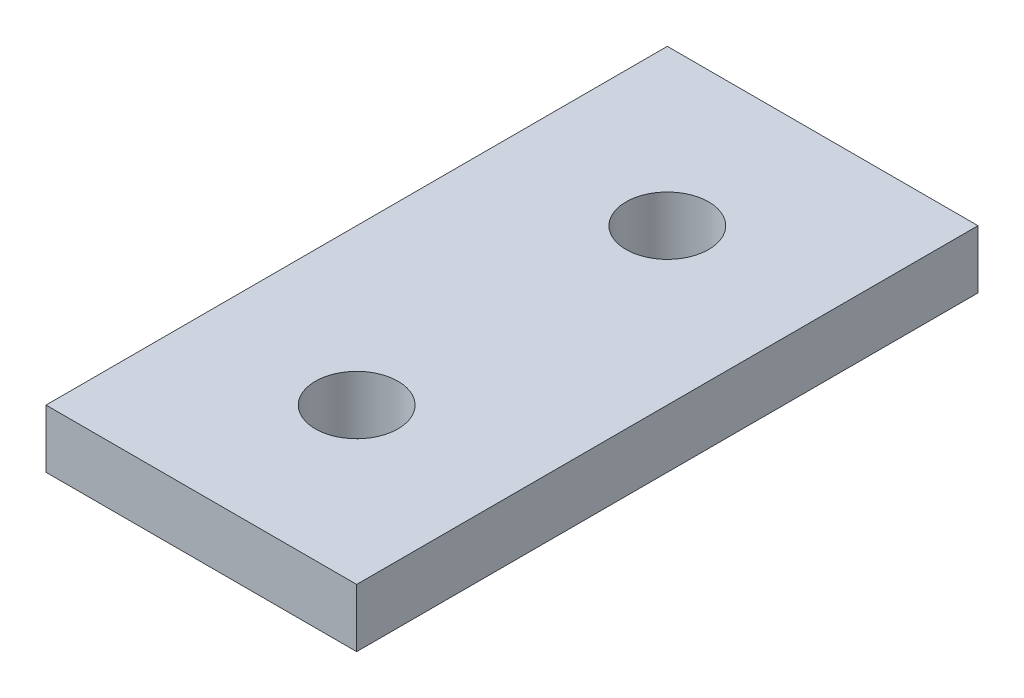
ISO-10303-21;
HEADER;
FILE_DESCRIPTION(('STEP AP214'),'2;1');
FILE_NAME('part.step','',(''),(''),'','','');
FILE_SCHEMA(('AUTOMOTIVE_DESIGN { 1 0 10303 214 1 1 1 1 }'));
ENDSEC;
DATA;
#1=APPLICATION_CONTEXT('core data for automotive mechanical design processes');
#2=APPLICATION_PROTOCOL_DEFINITION('international standard','automotive_design',2000,#1);
#3=PRODUCT_CONTEXT('',#1,'mechanical');
#4=PRODUCT('Part','Part','',(#3));
#5=PRODUCT_RELATED_PRODUCT_CATEGORY('part','',(#4));
#6=PRODUCT_DEFINITION_FORMATION('','',#4);
#7=PRODUCT_DEFINITION_CONTEXT('part definition',#1,'design');
#8=PRODUCT_DEFINITION('design','',#6,#7);
#9=PRODUCT_DEFINITION_SHAPE('','',#8);
#10=(LENGTH_UNIT() NAMED_UNIT(*) SI_UNIT(.MILLI.,.METRE.));
#11=(NAMED_UNIT(*) PLANE_ANGLE_UNIT() SI_UNIT($,.RADIAN.));
#12=(NAMED_UNIT(*) SI_UNIT($,.STERADIAN.) SOLID_ANGLE_UNIT());
#13=UNCERTAINTY_MEASURE_WITH_UNIT(LENGTH_MEASURE(1.E-05),#10,'distance_accuracy_value','');
#14=(GEOMETRIC_REPRESENTATION_CONTEXT(3) GLOBAL_UNCERTAINTY_ASSIGNED_CONTEXT((#13)) GLOBAL_UNIT_ASSIGNED_CONTEXT((#10,
#11,#12)) REPRESENTATION_CONTEXT('',''));
#15=CARTESIAN_POINT('',(0.,0.,0.));
#16=DIRECTION('',(0.,0.,1.));
#17=DIRECTION('',(1.,0.,0.));
#18=AXIS2_PLACEMENT_3D('',#15,#16,#17);
#19=CARTESIAN_POINT('',(0.,4.7625,0.));
#20=DIRECTION('',(0.,-1.,0.));
#21=DIRECTION('',(0.,0.,-1.));
#22=AXIS2_PLACEMENT_3D('',#19,#20,#21);
#23=PLANE('',#22);
#24=CARTESIAN_POINT('',(12.7,4.7625,-38.1));
#25=DIRECTION('',(0.,1.,0.));
#26=DIRECTION('',(0.,0.,1.));
#27=AXIS2_PLACEMENT_3D('',#24,#25,#26);
#28=CIRCLE('',#27,3.3782);
#29=CARTESIAN_POINT('',(12.7,4.7625,-41.4782));
#30=VERTEX_POINT('',#29);
#31=EDGE_CURVE('E101',#30,#30,#28,.T.);
#32=ORIENTED_EDGE('',*,*,#31,.F.);
#33=EDGE_LOOP('',(#32));
#34=FACE_BOUND('',#33,.T.);
#35=DIRECTION('',(0.,0.,1.));
#36=VECTOR('',#35,1.);
#37=CARTESIAN_POINT('',(0.,4.7625,0.));
#38=LINE('',#37,#36);
#39=CARTESIAN_POINT('',(0.,4.7625,-50.8));
#40=VERTEX_POINT('',#39);
#41=CARTESIAN_POINT('',(0.,4.7625,0.));
#42=VERTEX_POINT('',#41);
#43=EDGE_CURVE('E86',#40,#42,#38,.T.);
#44=ORIENTED_EDGE('',*,*,#43,.T.);
#45=DIRECTION('',(1.,0.,0.));
#46=VECTOR('',#45,1.);
#47=CARTESIAN_POINT('',(0.,4.7625,0.));
#48=LINE('',#47,#46);
#49=CARTESIAN_POINT('',(25.4,4.7625,0.));
#50=VERTEX_POINT('',#49);
#51=EDGE_CURVE('E81',#42,#50,#48,.T.);
#52=ORIENTED_EDGE('',*,*,#51,.T.);
#53=DIRECTION('',(0.,0.,-1.));
#54=VECTOR('',#53,1.);
#55=CARTESIAN_POINT('',(25.4,4.7625,0.));
#56=LINE('',#55,#54);
#57=CARTESIAN_POINT('',(25.4,4.7625,-50.8));
#58=VERTEX_POINT('',#57);
#59=EDGE_CURVE('E84',#50,#58,#56,.T.);
#60=ORIENTED_EDGE('',*,*,#59,.T.);
#61=DIRECTION('',(-1.,0.,0.));
#62=VECTOR('',#61,1.);
#63=CARTESIAN_POINT('',(0.,4.7625,-50.8));
#64=LINE('',#63,#62);
#65=EDGE_CURVE('E51',#58,#40,#64,.T.);
#66=ORIENTED_EDGE('',*,*,#65,.T.);
#67=EDGE_LOOP('',(#44,#52,#60,#66));
#68=FACE_BOUND('',#67,.T.);
#69=CARTESIAN_POINT('',(12.7,4.7625,-12.7));
#70=DIRECTION('',(0.,1.,0.));
#71=DIRECTION('',(0.,0.,1.));
#72=AXIS2_PLACEMENT_3D('',#69,#70,#71);
#73=CIRCLE('',#72,3.3782);
#74=CARTESIAN_POINT('',(12.7,4.7625,-16.0782));
#75=VERTEX_POINT('',#74);
#76=EDGE_CURVE('E116',#75,#75,#73,.T.);
#77=ORIENTED_EDGE('',*,*,#76,.F.);
#78=EDGE_LOOP('',(#77));
#79=FACE_BOUND('',#78,.T.);
#80=ADVANCED_FACE('F34',(#34,#68,#79),#23,.F.);
#81=CARTESIAN_POINT('',(0.,0.,0.));
#82=DIRECTION('',(0.,-1.,0.));
#83=DIRECTION('',(0.,0.,-1.));
#84=AXIS2_PLACEMENT_3D('',#81,#82,#83);
#85=PLANE('',#84);
#86=CARTESIAN_POINT('',(12.7,0.,-38.1));
#87=DIRECTION('',(0.,1.,0.));
#88=DIRECTION('',(0.,0.,1.));
#89=AXIS2_PLACEMENT_3D('',#86,#87,#88);
#90=CIRCLE('',#89,3.3782);
#91=CARTESIAN_POINT('',(12.7,0.,-41.4782));
#92=VERTEX_POINT('',#91);
#93=EDGE_CURVE('E113',#92,#92,#90,.T.);
#94=ORIENTED_EDGE('',*,*,#93,.T.);
#95=EDGE_LOOP('',(#94));
#96=FACE_BOUND('',#95,.T.);
#97=DIRECTION('',(0.,0.,1.));
#98=VECTOR('',#97,1.);
#99=CARTESIAN_POINT('',(0.,0.,0.));
#100=LINE('',#99,#98);
#101=CARTESIAN_POINT('',(0.,0.,-50.8));
#102=VERTEX_POINT('',#101);
#103=CARTESIAN_POINT('',(0.,0.,0.));
#104=VERTEX_POINT('',#103);
#105=EDGE_CURVE('E98',#102,#104,#100,.T.);
#106=ORIENTED_EDGE('',*,*,#105,.F.);
#107=DIRECTION('',(-1.,0.,0.));
#108=VECTOR('',#107,1.);
#109=CARTESIAN_POINT('',(0.,0.,-50.8));
#110=LINE('',#109,#108);
#111=CARTESIAN_POINT('',(25.4,0.,-50.8));
#112=VERTEX_POINT('',#111);
#113=EDGE_CURVE('E74',#112,#102,#110,.T.);
#114=ORIENTED_EDGE('',*,*,#113,.F.);
#115=DIRECTION('',(0.,0.,-1.));
#116=VECTOR('',#115,1.);
#117=CARTESIAN_POINT('',(25.4,0.,0.));
#118=LINE('',#117,#116);
#119=CARTESIAN_POINT('',(25.4,0.,0.));
#120=VERTEX_POINT('',#119);
#121=EDGE_CURVE('E68',#120,#112,#118,.T.);
#122=ORIENTED_EDGE('',*,*,#121,.F.);
#123=DIRECTION('',(1.,0.,0.));
#124=VECTOR('',#123,1.);
#125=CARTESIAN_POINT('',(0.,0.,0.));
#126=LINE('',#125,#124);
#127=EDGE_CURVE('E90',#104,#120,#126,.T.);
#128=ORIENTED_EDGE('',*,*,#127,.F.);
#129=EDGE_LOOP('',(#106,#114,#122,#128));
#130=FACE_BOUND('',#129,.T.);
#131=CARTESIAN_POINT('',(12.7,0.,-12.7));
#132=DIRECTION('',(0.,1.,0.));
#133=DIRECTION('',(0.,0.,1.));
#134=AXIS2_PLACEMENT_3D('',#131,#132,#133);
#135=CIRCLE('',#134,3.3782);
#136=CARTESIAN_POINT('',(12.7,0.,-16.0782));
#137=VERTEX_POINT('',#136);
#138=EDGE_CURVE('E119',#137,#137,#135,.T.);
#139=ORIENTED_EDGE('',*,*,#138,.T.);
#140=EDGE_LOOP('',(#139));
#141=FACE_BOUND('',#140,.T.);
#142=ADVANCED_FACE('F109',(#96,#130,#141),#85,.T.);
#143=CARTESIAN_POINT('',(0.,4.7625,0.));
#144=DIRECTION('',(1.,0.,0.));
#145=DIRECTION('',(0.,0.,-1.));
#146=AXIS2_PLACEMENT_3D('',#143,#144,#145);
#147=PLANE('',#146);
#148=ORIENTED_EDGE('',*,*,#105,.T.);
#149=DIRECTION('',(0.,-1.,0.));
#150=VECTOR('',#149,1.);
#151=CARTESIAN_POINT('',(0.,4.7625,0.));
#152=LINE('',#151,#150);
#153=EDGE_CURVE('E11',#42,#104,#152,.T.);
#154=ORIENTED_EDGE('',*,*,#153,.F.);
#155=ORIENTED_EDGE('',*,*,#43,.F.);
#156=DIRECTION('',(0.,-1.,0.));
#157=VECTOR('',#156,1.);
#158=CARTESIAN_POINT('',(0.,4.7625,-50.8));
#159=LINE('',#158,#157);
#160=EDGE_CURVE('E94',#40,#102,#159,.T.);
#161=ORIENTED_EDGE('',*,*,#160,.T.);
#162=EDGE_LOOP('',(#148,#154,#155,#161));
#163=FACE_BOUND('',#162,.T.);
#164=ADVANCED_FACE('F36',(#163),#147,.F.);
#165=CARTESIAN_POINT('',(0.,4.7625,0.));
#166=DIRECTION('',(0.,0.,-1.));
#167=DIRECTION('',(-1.,0.,0.));
#168=AXIS2_PLACEMENT_3D('',#165,#166,#167);
#169=PLANE('',#168);
#170=ORIENTED_EDGE('',*,*,#127,.T.);
#171=DIRECTION('',(0.,-1.,0.));
#172=VECTOR('',#171,1.);
#173=CARTESIAN_POINT('',(25.4,4.7625,0.));
#174=LINE('',#173,#172);
#175=EDGE_CURVE('E43',#50,#120,#174,.T.);
#176=ORIENTED_EDGE('',*,*,#175,.F.);
#177=ORIENTED_EDGE('',*,*,#51,.F.);
#178=ORIENTED_EDGE('',*,*,#153,.T.);
#179=EDGE_LOOP('',(#170,#176,#177,#178));
#180=FACE_BOUND('',#179,.T.);
#181=ADVANCED_FACE('F89',(#180),#169,.F.);
#182=CARTESIAN_POINT('',(25.4,4.7625,0.));
#183=DIRECTION('',(-1.,0.,0.));
#184=DIRECTION('',(0.,0.,1.));
#185=AXIS2_PLACEMENT_3D('',#182,#183,#184);
#186=PLANE('',#185);
#187=ORIENTED_EDGE('',*,*,#121,.T.);
#188=DIRECTION('',(0.,-1.,0.));
#189=VECTOR('',#188,1.);
#190=CARTESIAN_POINT('',(25.4,4.7625,-50.8));
#191=LINE('',#190,#189);
#192=EDGE_CURVE('E91',#58,#112,#191,.T.);
#193=ORIENTED_EDGE('',*,*,#192,.F.);
#194=ORIENTED_EDGE('',*,*,#59,.F.);
#195=ORIENTED_EDGE('',*,*,#175,.T.);
#196=EDGE_LOOP('',(#187,#193,#194,#195));
#197=FACE_BOUND('',#196,.T.);
#198=ADVANCED_FACE('F92',(#197),#186,.F.);
#199=CARTESIAN_POINT('',(0.,4.7625,-50.8));
#200=DIRECTION('',(0.,0.,1.));
#201=DIRECTION('',(1.,0.,0.));
#202=AXIS2_PLACEMENT_3D('',#199,#200,#201);
#203=PLANE('',#202);
#204=ORIENTED_EDGE('',*,*,#113,.T.);
#205=ORIENTED_EDGE('',*,*,#160,.F.);
#206=ORIENTED_EDGE('',*,*,#65,.F.);
#207=ORIENTED_EDGE('',*,*,#192,.T.);
#208=EDGE_LOOP('',(#204,#205,#206,#207));
#209=FACE_BOUND('',#208,.T.);
#210=ADVANCED_FACE('F106',(#209),#203,.F.);
#211=CARTESIAN_POINT('',(12.7,4.7625,-38.1));
#212=DIRECTION('',(0.,-1.,0.));
#213=DIRECTION('',(0.,0.,-1.));
#214=AXIS2_PLACEMENT_3D('',#211,#212,#213);
#215=CYLINDRICAL_SURFACE('',#214,3.3782);
#216=CARTESIAN_POINT('',(12.7,4.7625,-41.4782));
#217=CARTESIAN_POINT('',(12.7,4.712890625,-41.4782));
#218=CARTESIAN_POINT('',(12.7,4.66328125,-41.4782));
#219=CARTESIAN_POINT('',(12.7,4.5640625,-41.4782));
#220=CARTESIAN_POINT('',(12.7,4.514453125,-41.4782));
#221=CARTESIAN_POINT('',(12.7,4.415234375,-41.4782));
#222=CARTESIAN_POINT('',(12.7,4.365625,-41.4782));
#223=CARTESIAN_POINT('',(12.7,4.26640625,-41.4782));
#224=CARTESIAN_POINT('',(12.7,4.216796875,-41.4782));
#225=CARTESIAN_POINT('',(12.7,4.117578125,-41.4782));
#226=CARTESIAN_POINT('',(12.7,4.06796875,-41.4782));
#227=CARTESIAN_POINT('',(12.7,3.96875,-41.4782));
#228=CARTESIAN_POINT('',(12.7,3.919140625,-41.4782));
#229=CARTESIAN_POINT('',(12.7,3.819921875,-41.4782));
#230=CARTESIAN_POINT('',(12.7,3.7703125,-41.4782));
#231=CARTESIAN_POINT('',(12.7,3.67109375,-41.4782));
#232=CARTESIAN_POINT('',(12.7,3.621484375,-41.4782));
#233=CARTESIAN_POINT('',(12.7,3.522265625,-41.4782));
#234=CARTESIAN_POINT('',(12.7,3.47265625,-41.4782));
#235=CARTESIAN_POINT('',(12.7,3.3734375,-41.4782));
#236=CARTESIAN_POINT('',(12.7,3.323828125,-41.4782));
#237=CARTESIAN_POINT('',(12.7,3.224609375,-41.4782));
#238=CARTESIAN_POINT('',(12.7,3.175,-41.4782));
#239=CARTESIAN_POINT('',(12.7,3.07578125,-41.4782));
#240=CARTESIAN_POINT('',(12.7,3.026171875,-41.4782));
#241=CARTESIAN_POINT('',(12.7,2.926953125,-41.4782));
#242=CARTESIAN_POINT('',(12.7,2.87734375,-41.4782));
#243=CARTESIAN_POINT('',(12.7,2.778125,-41.4782));
#244=CARTESIAN_POINT('',(12.7,2.728515625,-41.4782));
#245=CARTESIAN_POINT('',(12.7,2.629296875,-41.4782));
#246=CARTESIAN_POINT('',(12.7,2.5796875,-41.4782));
#247=CARTESIAN_POINT('',(12.7,2.48046875,-41.4782));
#248=CARTESIAN_POINT('',(12.7,2.430859375,-41.4782));
#249=CARTESIAN_POINT('',(12.7,2.331640625,-41.4782));
#250=CARTESIAN_POINT('',(12.7,2.28203125,-41.4782));
#251=CARTESIAN_POINT('',(12.7,2.1828125,-41.4782));
#252=CARTESIAN_POINT('',(12.7,2.133203125,-41.4782));
#253=CARTESIAN_POINT('',(12.7,2.033984375,-41.4782));
#254=CARTESIAN_POINT('',(12.7,1.984375,-41.4782));
#255=CARTESIAN_POINT('',(12.7,1.88515625,-41.4782));
#256=CARTESIAN_POINT('',(12.7,1.835546875,-41.4782));
#257=CARTESIAN_POINT('',(12.7,1.736328125,-41.4782));
#258=CARTESIAN_POINT('',(12.7,1.68671875,-41.4782));
#259=CARTESIAN_POINT('',(12.7,1.5875,-41.4782));
#260=CARTESIAN_POINT('',(12.7,1.537890625,-41.4782));
#261=CARTESIAN_POINT('',(12.7,1.438671875,-41.4782));
#262=CARTESIAN_POINT('',(12.7,1.3890625,-41.4782));
#263=CARTESIAN_POINT('',(12.7,1.28984375,-41.4782));
#264=CARTESIAN_POINT('',(12.7,1.240234375,-41.4782));
#265=CARTESIAN_POINT('',(12.7,1.141015625,-41.4782));
#266=CARTESIAN_POINT('',(12.7,1.09140625,-41.4782));
#267=CARTESIAN_POINT('',(12.7,0.992187499999999,-41.4782));
#268=CARTESIAN_POINT('',(12.7,0.942578124999999,-41.4782));
#269=CARTESIAN_POINT('',(12.7,0.843359374999999,-41.4782));
#270=CARTESIAN_POINT('',(12.7,0.793749999999999,-41.4782));
#271=CARTESIAN_POINT('',(12.7,0.694531249999999,-41.4782));
#272=CARTESIAN_POINT('',(12.7,0.644921875,-41.4782));
#273=CARTESIAN_POINT('',(12.7,0.545703124999999,-41.4782));
#274=CARTESIAN_POINT('',(12.7,0.496093749999999,-41.4782));
#275=CARTESIAN_POINT('',(12.7,0.396874999999999,-41.4782));
#276=CARTESIAN_POINT('',(12.7,0.347265624999999,-41.4782));
#277=CARTESIAN_POINT('',(12.7,0.248046874999999,-41.4782));
#278=CARTESIAN_POINT('',(12.7,0.198437499999999,-41.4782));
#279=CARTESIAN_POINT('',(12.7,0.0992187499999992,-41.4782));
#280=CARTESIAN_POINT('',(12.7,0.0496093749999992,-41.4782));
#281=CARTESIAN_POINT('',(12.7,0.,-41.4782));
#282=B_SPLINE_CURVE_WITH_KNOTS('',3,(#216,#217,#218,#219,#220,#221,#222,#223,#224,#225,#226,
#227,#228,#229,#230,#231,#232,#233,#234,#235,#236,#237,#238,#239,#240,#241,#242,#243,#244,#245,
#246,#247,#248,#249,#250,#251,#252,#253,#254,#255,#256,#257,#258,#259,#260,#261,#262,#263,#264,
#265,#266,#267,#268,#269,#270,#271,#272,#273,#274,#275,#276,#277,#278,#279,#280,#281),
.UNSPECIFIED.,.F.,.F.,(4,2,2,2,2,2,2,2,2,2,2,2,2,2,2,2,2,2,2,2,2,2,2,2,2,2,2,2,2,2,2,2,4),(0.,
0.148828125000001,0.297656250000001,0.446484375000001,0.595312500000001,0.744140625000001,
0.892968750000001,1.041796875,1.190625,1.339453125,1.48828125,1.637109375,1.7859375,1.934765625,
2.08359375,2.232421875,2.38125,2.530078125,2.67890625,2.827734375,2.9765625,3.125390625,
3.27421875,3.423046875,3.571875,3.720703125,3.86953125,4.018359375,4.1671875,4.316015625,
4.46484375,4.613671875,4.7625),.UNSPECIFIED.);
#283=EDGE_CURVE('BSEAM137',#30,#92,#282,.T.);
#284=ORIENTED_EDGE('',*,*,#31,.T.);
#285=ORIENTED_EDGE('',*,*,#93,.F.);
#286=ORIENTED_EDGE('',*,*,#283,.T.);
#287=ORIENTED_EDGE('',*,*,#283,.F.);
#288=EDGE_LOOP('',(#284,#286,#285,#287));
#289=FACE_BOUND('',#288,.T.);
#290=ADVANCED_FACE('F137',(#289),#215,.F.);
#291=CARTESIAN_POINT('',(12.7,4.7625,-12.7));
#292=DIRECTION('',(0.,-1.,0.));
#293=DIRECTION('',(0.,0.,-1.));
#294=AXIS2_PLACEMENT_3D('',#291,#292,#293);
#295=CYLINDRICAL_SURFACE('',#294,3.3782);
#296=CARTESIAN_POINT('',(12.7,4.7625,-16.0782));
#297=CARTESIAN_POINT('',(12.7,4.712890625,-16.0782));
#298=CARTESIAN_POINT('',(12.7,4.66328125,-16.0782));
#299=CARTESIAN_POINT('',(12.7,4.5640625,-16.0782));
#300=CARTESIAN_POINT('',(12.7,4.514453125,-16.0782));
#301=CARTESIAN_POINT('',(12.7,4.415234375,-16.0782));
#302=CARTESIAN_POINT('',(12.7,4.365625,-16.0782));
#303=CARTESIAN_POINT('',(12.7,4.26640625,-16.0782));
#304=CARTESIAN_POINT('',(12.7,4.216796875,-16.0782));
#305=CARTESIAN_POINT('',(12.7,4.117578125,-16.0782));
#306=CARTESIAN_POINT('',(12.7,4.06796875,-16.0782));
#307=CARTESIAN_POINT('',(12.7,3.96875,-16.0782));
#308=CARTESIAN_POINT('',(12.7,3.919140625,-16.0782));
#309=CARTESIAN_POINT('',(12.7,3.819921875,-16.0782));
#310=CARTESIAN_POINT('',(12.7,3.7703125,-16.0782));
#311=CARTESIAN_POINT('',(12.7,3.67109375,-16.0782));
#312=CARTESIAN_POINT('',(12.7,3.621484375,-16.0782));
#313=CARTESIAN_POINT('',(12.7,3.522265625,-16.0782));
#314=CARTESIAN_POINT('',(12.7,3.47265625,-16.0782));
#315=CARTESIAN_POINT('',(12.7,3.3734375,-16.0782));
#316=CARTESIAN_POINT('',(12.7,3.323828125,-16.0782));
#317=CARTESIAN_POINT('',(12.7,3.224609375,-16.0782));
#318=CARTESIAN_POINT('',(12.7,3.175,-16.0782));
#319=CARTESIAN_POINT('',(12.7,3.07578125,-16.0782));
#320=CARTESIAN_POINT('',(12.7,3.026171875,-16.0782));
#321=CARTESIAN_POINT('',(12.7,2.926953125,-16.0782));
#322=CARTESIAN_POINT('',(12.7,2.87734375,-16.0782));
#323=CARTESIAN_POINT('',(12.7,2.778125,-16.0782));
#324=CARTESIAN_POINT('',(12.7,2.728515625,-16.0782));
#325=CARTESIAN_POINT('',(12.7,2.629296875,-16.0782));
#326=CARTESIAN_POINT('',(12.7,2.5796875,-16.0782));
#327=CARTESIAN_POINT('',(12.7,2.48046875,-16.0782));
#328=CARTESIAN_POINT('',(12.7,2.430859375,-16.0782));
#329=CARTESIAN_POINT('',(12.7,2.331640625,-16.0782));
#330=CARTESIAN_POINT('',(12.7,2.28203125,-16.0782));
#331=CARTESIAN_POINT('',(12.7,2.1828125,-16.0782));
#332=CARTESIAN_POINT('',(12.7,2.133203125,-16.0782));
#333=CARTESIAN_POINT('',(12.7,2.033984375,-16.0782));
#334=CARTESIAN_POINT('',(12.7,1.984375,-16.0782));
#335=CARTESIAN_POINT('',(12.7,1.88515625,-16.0782));
#336=CARTESIAN_POINT('',(12.7,1.835546875,-16.0782));
#337=CARTESIAN_POINT('',(12.7,1.736328125,-16.0782));
#338=CARTESIAN_POINT('',(12.7,1.68671875,-16.0782));
#339=CARTESIAN_POINT('',(12.7,1.5875,-16.0782));
#340=CARTESIAN_POINT('',(12.7,1.537890625,-16.0782));
#341=CARTESIAN_POINT('',(12.7,1.438671875,-16.0782));
#342=CARTESIAN_POINT('',(12.7,1.3890625,-16.0782));
#343=CARTESIAN_POINT('',(12.7,1.28984375,-16.0782));
#344=CARTESIAN_POINT('',(12.7,1.240234375,-16.0782));
#345=CARTESIAN_POINT('',(12.7,1.141015625,-16.0782));
#346=CARTESIAN_POINT('',(12.7,1.09140625,-16.0782));
#347=CARTESIAN_POINT('',(12.7,0.992187499999999,-16.0782));
#348=CARTESIAN_POINT('',(12.7,0.942578124999999,-16.0782));
#349=CARTESIAN_POINT('',(12.7,0.843359374999999,-16.0782));
#350=CARTESIAN_POINT('',(12.7,0.793749999999999,-16.0782));
#351=CARTESIAN_POINT('',(12.7,0.694531249999999,-16.0782));
#352=CARTESIAN_POINT('',(12.7,0.644921875,-16.0782));
#353=CARTESIAN_POINT('',(12.7,0.545703124999999,-16.0782));
#354=CARTESIAN_POINT('',(12.7,0.496093749999999,-16.0782));
#355=CARTESIAN_POINT('',(12.7,0.396874999999999,-16.0782));
#356=CARTESIAN_POINT('',(12.7,0.347265624999999,-16.0782));
#357=CARTESIAN_POINT('',(12.7,0.248046874999999,-16.0782));
#358=CARTESIAN_POINT('',(12.7,0.198437499999999,-16.0782));
#359=CARTESIAN_POINT('',(12.7,0.0992187499999992,-16.0782));
#360=CARTESIAN_POINT('',(12.7,0.0496093749999992,-16.0782));
#361=CARTESIAN_POINT('',(12.7,0.,-16.0782));
#362=B_SPLINE_CURVE_WITH_KNOTS('',3,(#296,#297,#298,#299,#300,#301,#302,#303,#304,#305,#306,
#307,#308,#309,#310,#311,#312,#313,#314,#315,#316,#317,#318,#319,#320,#321,#322,#323,#324,#325,
#326,#327,#328,#329,#330,#331,#332,#333,#334,#335,#336,#337,#338,#339,#340,#341,#342,#343,#344,
#345,#346,#347,#348,#349,#350,#351,#352,#353,#354,#355,#356,#357,#358,#359,#360,#361),
.UNSPECIFIED.,.F.,.F.,(4,2,2,2,2,2,2,2,2,2,2,2,2,2,2,2,2,2,2,2,2,2,2,2,2,2,2,2,2,2,2,2,4),(0.,
0.148828125000001,0.297656250000001,0.446484375000001,0.595312500000001,0.744140625000001,
0.892968750000001,1.041796875,1.190625,1.339453125,1.48828125,1.637109375,1.7859375,1.934765625,
2.08359375,2.232421875,2.38125,2.530078125,2.67890625,2.827734375,2.9765625,3.125390625,
3.27421875,3.423046875,3.571875,3.720703125,3.86953125,4.018359375,4.1671875,4.316015625,
4.46484375,4.613671875,4.7625),.UNSPECIFIED.);
#363=EDGE_CURVE('BSEAM125',#75,#137,#362,.T.);
#364=ORIENTED_EDGE('',*,*,#76,.T.);
#365=ORIENTED_EDGE('',*,*,#138,.F.);
#366=ORIENTED_EDGE('',*,*,#363,.T.);
#367=ORIENTED_EDGE('',*,*,#363,.F.);
#368=EDGE_LOOP('',(#364,#366,#365,#367));
#369=FACE_BOUND('',#368,.T.);
#370=ADVANCED_FACE('F125',(#369),#295,.F.);
#371=CLOSED_SHELL('',(#80,#142,#164,#181,#198,#210,#290,#370));
#372=MANIFOLD_SOLID_BREP('B2',#371);
#373=ADVANCED_BREP_SHAPE_REPRESENTATION('',(#18,#372),#14);
#374=SHAPE_DEFINITION_REPRESENTATION(#9,#373);
ENDSEC;
END-ISO-10303-21;
